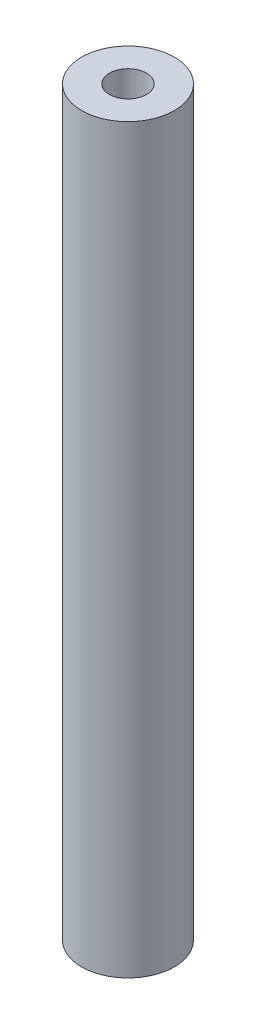
ISO-10303-21;
HEADER;
FILE_DESCRIPTION(('STEP AP214'),'2;1');
FILE_NAME('part.step','',(''),(''),'','','');
FILE_SCHEMA(('AUTOMOTIVE_DESIGN { 1 0 10303 214 1 1 1 1 }'));
ENDSEC;
DATA;
#1=APPLICATION_CONTEXT('core data for automotive mechanical design processes');
#2=APPLICATION_PROTOCOL_DEFINITION('international standard','automotive_design',2000,#1);
#3=PRODUCT_CONTEXT('',#1,'mechanical');
#4=PRODUCT('Part','Part','',(#3));
#5=PRODUCT_RELATED_PRODUCT_CATEGORY('part','',(#4));
#6=PRODUCT_DEFINITION_FORMATION('','',#4);
#7=PRODUCT_DEFINITION_CONTEXT('part definition',#1,'design');
#8=PRODUCT_DEFINITION('design','',#6,#7);
#9=PRODUCT_DEFINITION_SHAPE('','',#8);
#10=(LENGTH_UNIT() NAMED_UNIT(*) SI_UNIT(.MILLI.,.METRE.));
#11=(NAMED_UNIT(*) PLANE_ANGLE_UNIT() SI_UNIT($,.RADIAN.));
#12=(NAMED_UNIT(*) SI_UNIT($,.STERADIAN.) SOLID_ANGLE_UNIT());
#13=UNCERTAINTY_MEASURE_WITH_UNIT(LENGTH_MEASURE(1.E-05),#10,'distance_accuracy_value','');
#14=(GEOMETRIC_REPRESENTATION_CONTEXT(3) GLOBAL_UNCERTAINTY_ASSIGNED_CONTEXT((#13)) GLOBAL_UNIT_ASSIGNED_CONTEXT((#10,
#11,#12)) REPRESENTATION_CONTEXT('',''));
#15=CARTESIAN_POINT('',(0.,0.,0.));
#16=DIRECTION('',(0.,0.,1.));
#17=DIRECTION('',(1.,0.,0.));
#18=AXIS2_PLACEMENT_3D('',#15,#16,#17);
#19=CARTESIAN_POINT('',(0.,40.,0.));
#20=DIRECTION('',(0.,1.,0.));
#21=DIRECTION('',(0.,0.,1.));
#22=AXIS2_PLACEMENT_3D('',#19,#20,#21);
#23=PLANE('',#22);
#24=CARTESIAN_POINT('',(0.,40.,0.));
#25=DIRECTION('',(0.,1.,0.));
#26=DIRECTION('',(0.,0.,1.));
#27=AXIS2_PLACEMENT_3D('',#24,#25,#26);
#28=CIRCLE('',#27,2.5);
#29=CARTESIAN_POINT('',(0.,40.,2.5));
#30=VERTEX_POINT('',#29);
#31=EDGE_CURVE('E10',#30,#30,#28,.T.);
#32=ORIENTED_EDGE('',*,*,#31,.T.);
#33=EDGE_LOOP('',(#32));
#34=FACE_BOUND('',#33,.T.);
#35=CARTESIAN_POINT('',(0.,40.,0.));
#36=DIRECTION('',(0.,1.,0.));
#37=DIRECTION('',(0.,0.,1.));
#38=AXIS2_PLACEMENT_3D('',#35,#36,#37);
#39=CIRCLE('',#38,1.);
#40=CARTESIAN_POINT('',(0.,40.,1.));
#41=VERTEX_POINT('',#40);
#42=EDGE_CURVE('E54',#41,#41,#39,.T.);
#43=ORIENTED_EDGE('',*,*,#42,.F.);
#44=EDGE_LOOP('',(#43));
#45=FACE_BOUND('',#44,.T.);
#46=ADVANCED_FACE('F41',(#34,#45),#23,.T.);
#47=CARTESIAN_POINT('',(0.,0.,0.));
#48=DIRECTION('',(0.,1.,0.));
#49=DIRECTION('',(0.,0.,1.));
#50=AXIS2_PLACEMENT_3D('',#47,#48,#49);
#51=PLANE('',#50);
#52=CARTESIAN_POINT('',(0.,0.,0.));
#53=DIRECTION('',(0.,1.,0.));
#54=DIRECTION('',(0.,0.,1.));
#55=AXIS2_PLACEMENT_3D('',#52,#53,#54);
#56=CIRCLE('',#55,2.5);
#57=CARTESIAN_POINT('',(0.,0.,2.5));
#58=VERTEX_POINT('',#57);
#59=EDGE_CURVE('E45',#58,#58,#56,.T.);
#60=ORIENTED_EDGE('',*,*,#59,.F.);
#61=EDGE_LOOP('',(#60));
#62=FACE_BOUND('',#61,.T.);
#63=CARTESIAN_POINT('',(0.,0.,0.));
#64=DIRECTION('',(0.,1.,0.));
#65=DIRECTION('',(0.,0.,1.));
#66=AXIS2_PLACEMENT_3D('',#63,#64,#65);
#67=CIRCLE('',#66,1.);
#68=CARTESIAN_POINT('',(0.,0.,1.));
#69=VERTEX_POINT('',#68);
#70=EDGE_CURVE('E56',#69,#69,#67,.T.);
#71=ORIENTED_EDGE('',*,*,#70,.T.);
#72=EDGE_LOOP('',(#71));
#73=FACE_BOUND('',#72,.T.);
#74=ADVANCED_FACE('F68',(#62,#73),#51,.F.);
#75=CARTESIAN_POINT('',(0.,40.,0.));
#76=DIRECTION('',(0.,-1.,0.));
#77=DIRECTION('',(0.,0.,-1.));
#78=AXIS2_PLACEMENT_3D('',#75,#76,#77);
#79=CYLINDRICAL_SURFACE('',#78,2.5);
#80=ORIENTED_EDGE('',*,*,#31,.F.);
#81=EDGE_LOOP('',(#80));
#82=FACE_BOUND('',#81,.T.);
#83=ORIENTED_EDGE('',*,*,#59,.T.);
#84=EDGE_LOOP('',(#83));
#85=FACE_BOUND('',#84,.T.);
#86=ADVANCED_FACE('F43',(#82,#85),#79,.T.);
#87=CARTESIAN_POINT('',(0.,40.,0.));
#88=DIRECTION('',(0.,-1.,0.));
#89=DIRECTION('',(0.,0.,-1.));
#90=AXIS2_PLACEMENT_3D('',#87,#88,#89);
#91=CYLINDRICAL_SURFACE('',#90,1.);
#92=ORIENTED_EDGE('',*,*,#42,.T.);
#93=EDGE_LOOP('',(#92));
#94=FACE_BOUND('',#93,.T.);
#95=ORIENTED_EDGE('',*,*,#70,.F.);
#96=EDGE_LOOP('',(#95));
#97=FACE_BOUND('',#96,.T.);
#98=ADVANCED_FACE('F64',(#94,#97),#91,.F.);
#99=CLOSED_SHELL('',(#46,#74,#86,#98));
#100=MANIFOLD_SOLID_BREP('B2',#99);
#101=ADVANCED_BREP_SHAPE_REPRESENTATION('',(#18,#100),#14);
#102=SHAPE_DEFINITION_REPRESENTATION(#9,#101);
ENDSEC;
END-ISO-10303-21;
